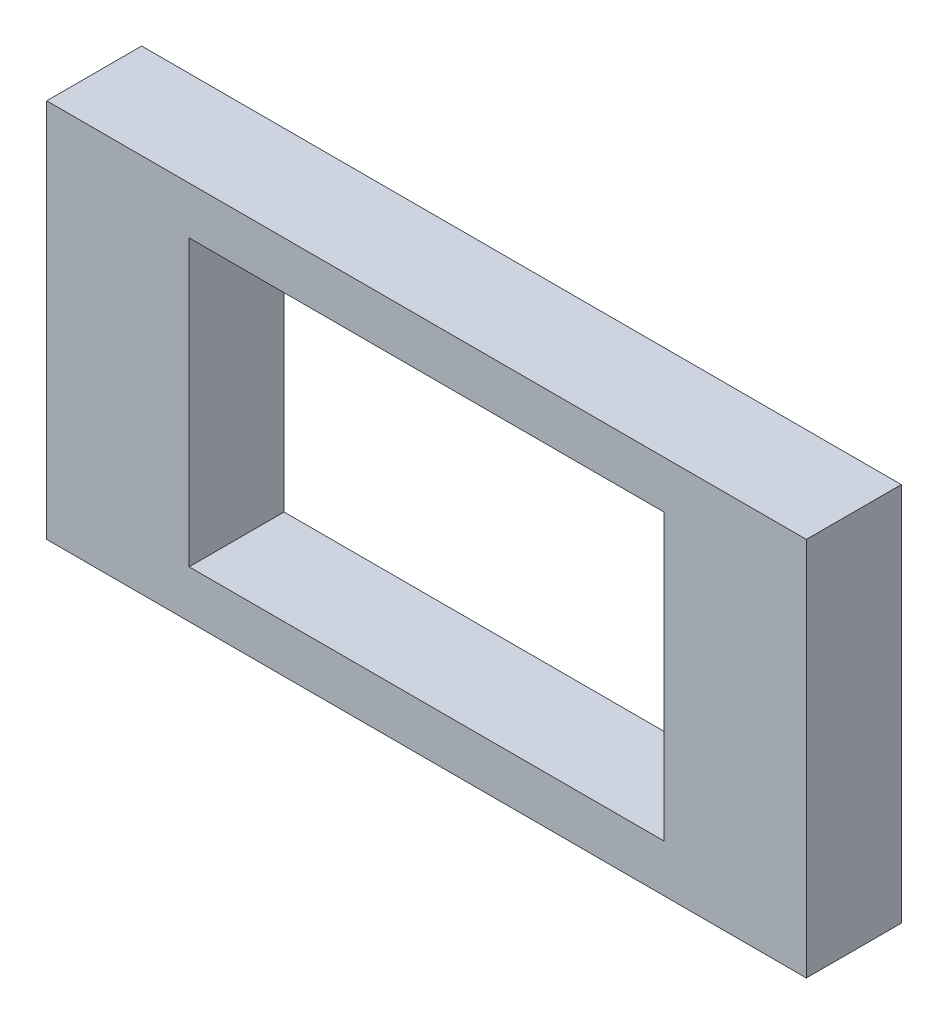
ISO-10303-21;
HEADER;
FILE_DESCRIPTION(('STEP AP214'),'2;1');
FILE_NAME('part.step','',(''),(''),'','','');
FILE_SCHEMA(('AUTOMOTIVE_DESIGN { 1 0 10303 214 1 1 1 1 }'));
ENDSEC;
DATA;
#1=APPLICATION_CONTEXT('core data for automotive mechanical design processes');
#2=APPLICATION_PROTOCOL_DEFINITION('international standard','automotive_design',2000,#1);
#3=PRODUCT_CONTEXT('',#1,'mechanical');
#4=PRODUCT('Part','Part','',(#3));
#5=PRODUCT_RELATED_PRODUCT_CATEGORY('part','',(#4));
#6=PRODUCT_DEFINITION_FORMATION('','',#4);
#7=PRODUCT_DEFINITION_CONTEXT('part definition',#1,'design');
#8=PRODUCT_DEFINITION('design','',#6,#7);
#9=PRODUCT_DEFINITION_SHAPE('','',#8);
#10=(LENGTH_UNIT() NAMED_UNIT(*) SI_UNIT(.MILLI.,.METRE.));
#11=(NAMED_UNIT(*) PLANE_ANGLE_UNIT() SI_UNIT($,.RADIAN.));
#12=(NAMED_UNIT(*) SI_UNIT($,.STERADIAN.) SOLID_ANGLE_UNIT());
#13=UNCERTAINTY_MEASURE_WITH_UNIT(LENGTH_MEASURE(1.E-05),#10,'distance_accuracy_value','');
#14=(GEOMETRIC_REPRESENTATION_CONTEXT(3) GLOBAL_UNCERTAINTY_ASSIGNED_CONTEXT((#13)) GLOBAL_UNIT_ASSIGNED_CONTEXT((#10,
#11,#12)) REPRESENTATION_CONTEXT('',''));
#15=CARTESIAN_POINT('',(0.,0.,0.));
#16=DIRECTION('',(0.,0.,1.));
#17=DIRECTION('',(1.,0.,0.));
#18=AXIS2_PLACEMENT_3D('',#15,#16,#17);
#19=CARTESIAN_POINT('',(0.,0.,2.));
#20=DIRECTION('',(0.,0.,-1.));
#21=DIRECTION('',(-1.,0.,0.));
#22=AXIS2_PLACEMENT_3D('',#19,#20,#21);
#23=PLANE('',#22);
#24=DIRECTION('',(0.,1.,0.));
#25=VECTOR('',#24,1.);
#26=CARTESIAN_POINT('',(8.,-4.,2.));
#27=LINE('',#26,#25);
#28=CARTESIAN_POINT('',(8.,-4.,2.));
#29=VERTEX_POINT('',#28);
#30=CARTESIAN_POINT('',(8.,4.,2.));
#31=VERTEX_POINT('',#30);
#32=EDGE_CURVE('E134',#29,#31,#27,.T.);
#33=ORIENTED_EDGE('',*,*,#32,.T.);
#34=DIRECTION('',(-1.,0.,0.));
#35=VECTOR('',#34,1.);
#36=CARTESIAN_POINT('',(-8.,4.,2.));
#37=LINE('',#36,#35);
#38=CARTESIAN_POINT('',(-8.,4.,2.));
#39=VERTEX_POINT('',#38);
#40=EDGE_CURVE('E137',#31,#39,#37,.T.);
#41=ORIENTED_EDGE('',*,*,#40,.T.);
#42=DIRECTION('',(0.,-1.,0.));
#43=VECTOR('',#42,1.);
#44=CARTESIAN_POINT('',(-8.,-4.,2.));
#45=LINE('',#44,#43);
#46=CARTESIAN_POINT('',(-8.,-4.,2.));
#47=VERTEX_POINT('',#46);
#48=EDGE_CURVE('E140',#39,#47,#45,.T.);
#49=ORIENTED_EDGE('',*,*,#48,.T.);
#50=DIRECTION('',(1.,0.,0.));
#51=VECTOR('',#50,1.);
#52=CARTESIAN_POINT('',(-8.,-4.,2.));
#53=LINE('',#52,#51);
#54=EDGE_CURVE('E142',#47,#29,#53,.T.);
#55=ORIENTED_EDGE('',*,*,#54,.T.);
#56=EDGE_LOOP('',(#33,#41,#49,#55));
#57=FACE_BOUND('',#56,.T.);
#58=DIRECTION('',(0.,1.,0.));
#59=VECTOR('',#58,1.);
#60=CARTESIAN_POINT('',(5.,-3.,2.));
#61=LINE('',#60,#59);
#62=CARTESIAN_POINT('',(5.,-3.,2.));
#63=VERTEX_POINT('',#62);
#64=CARTESIAN_POINT('',(5.,3.,2.));
#65=VERTEX_POINT('',#64);
#66=EDGE_CURVE('E98',#63,#65,#61,.T.);
#67=ORIENTED_EDGE('',*,*,#66,.F.);
#68=DIRECTION('',(1.,0.,0.));
#69=VECTOR('',#68,1.);
#70=CARTESIAN_POINT('',(-5.,-3.,2.));
#71=LINE('',#70,#69);
#72=CARTESIAN_POINT('',(-5.,-3.,2.));
#73=VERTEX_POINT('',#72);
#74=EDGE_CURVE('E120',#73,#63,#71,.T.);
#75=ORIENTED_EDGE('',*,*,#74,.F.);
#76=DIRECTION('',(0.,-1.,0.));
#77=VECTOR('',#76,1.);
#78=CARTESIAN_POINT('',(-5.,-3.,2.));
#79=LINE('',#78,#77);
#80=CARTESIAN_POINT('',(-5.,3.,2.));
#81=VERTEX_POINT('',#80);
#82=EDGE_CURVE('E118',#81,#73,#79,.T.);
#83=ORIENTED_EDGE('',*,*,#82,.F.);
#84=DIRECTION('',(-1.,0.,0.));
#85=VECTOR('',#84,1.);
#86=CARTESIAN_POINT('',(-5.,3.,2.));
#87=LINE('',#86,#85);
#88=EDGE_CURVE('E106',#65,#81,#87,.T.);
#89=ORIENTED_EDGE('',*,*,#88,.F.);
#90=EDGE_LOOP('',(#67,#75,#83,#89));
#91=FACE_BOUND('',#90,.T.);
#92=ADVANCED_FACE('F33',(#57,#91),#23,.F.);
#93=CARTESIAN_POINT('',(0.,0.,0.));
#94=DIRECTION('',(0.,0.,-1.));
#95=DIRECTION('',(-1.,0.,0.));
#96=AXIS2_PLACEMENT_3D('',#93,#94,#95);
#97=PLANE('',#96);
#98=DIRECTION('',(0.,1.,0.));
#99=VECTOR('',#98,1.);
#100=CARTESIAN_POINT('',(8.,-4.,0.));
#101=LINE('',#100,#99);
#102=CARTESIAN_POINT('',(8.,-4.,0.));
#103=VERTEX_POINT('',#102);
#104=CARTESIAN_POINT('',(8.,4.,0.));
#105=VERTEX_POINT('',#104);
#106=EDGE_CURVE('E114',#103,#105,#101,.T.);
#107=ORIENTED_EDGE('',*,*,#106,.F.);
#108=DIRECTION('',(1.,0.,0.));
#109=VECTOR('',#108,1.);
#110=CARTESIAN_POINT('',(-8.,-4.,0.));
#111=LINE('',#110,#109);
#112=CARTESIAN_POINT('',(-8.,-4.,0.));
#113=VERTEX_POINT('',#112);
#114=EDGE_CURVE('E138',#113,#103,#111,.T.);
#115=ORIENTED_EDGE('',*,*,#114,.F.);
#116=DIRECTION('',(0.,-1.,0.));
#117=VECTOR('',#116,1.);
#118=CARTESIAN_POINT('',(-8.,-4.,0.));
#119=LINE('',#118,#117);
#120=CARTESIAN_POINT('',(-8.,4.,0.));
#121=VERTEX_POINT('',#120);
#122=EDGE_CURVE('E149',#121,#113,#119,.T.);
#123=ORIENTED_EDGE('',*,*,#122,.F.);
#124=DIRECTION('',(-1.,0.,0.));
#125=VECTOR('',#124,1.);
#126=CARTESIAN_POINT('',(-8.,4.,0.));
#127=LINE('',#126,#125);
#128=EDGE_CURVE('E147',#105,#121,#127,.T.);
#129=ORIENTED_EDGE('',*,*,#128,.F.);
#130=EDGE_LOOP('',(#107,#115,#123,#129));
#131=FACE_BOUND('',#130,.T.);
#132=DIRECTION('',(1.,0.,0.));
#133=VECTOR('',#132,1.);
#134=CARTESIAN_POINT('',(-5.,-3.,0.));
#135=LINE('',#134,#133);
#136=CARTESIAN_POINT('',(-5.,-3.,0.));
#137=VERTEX_POINT('',#136);
#138=CARTESIAN_POINT('',(5.,-3.,0.));
#139=VERTEX_POINT('',#138);
#140=EDGE_CURVE('E107',#137,#139,#135,.T.);
#141=ORIENTED_EDGE('',*,*,#140,.T.);
#142=DIRECTION('',(0.,1.,0.));
#143=VECTOR('',#142,1.);
#144=CARTESIAN_POINT('',(5.,-3.,0.));
#145=LINE('',#144,#143);
#146=CARTESIAN_POINT('',(5.,3.,0.));
#147=VERTEX_POINT('',#146);
#148=EDGE_CURVE('E56',#139,#147,#145,.T.);
#149=ORIENTED_EDGE('',*,*,#148,.T.);
#150=DIRECTION('',(-1.,0.,0.));
#151=VECTOR('',#150,1.);
#152=CARTESIAN_POINT('',(-5.,3.,0.));
#153=LINE('',#152,#151);
#154=CARTESIAN_POINT('',(-5.,3.,0.));
#155=VERTEX_POINT('',#154);
#156=EDGE_CURVE('E113',#147,#155,#153,.T.);
#157=ORIENTED_EDGE('',*,*,#156,.T.);
#158=DIRECTION('',(0.,-1.,0.));
#159=VECTOR('',#158,1.);
#160=CARTESIAN_POINT('',(-5.,-3.,0.));
#161=LINE('',#160,#159);
#162=EDGE_CURVE('E126',#155,#137,#161,.T.);
#163=ORIENTED_EDGE('',*,*,#162,.T.);
#164=EDGE_LOOP('',(#141,#149,#157,#163));
#165=FACE_BOUND('',#164,.T.);
#166=ADVANCED_FACE('F167',(#131,#165),#97,.T.);
#167=CARTESIAN_POINT('',(8.,-4.,2.));
#168=DIRECTION('',(-1.,0.,0.));
#169=DIRECTION('',(0.,0.,1.));
#170=AXIS2_PLACEMENT_3D('',#167,#168,#169);
#171=PLANE('',#170);
#172=ORIENTED_EDGE('',*,*,#106,.T.);
#173=DIRECTION('',(0.,0.,-1.));
#174=VECTOR('',#173,1.);
#175=CARTESIAN_POINT('',(8.,4.,2.));
#176=LINE('',#175,#174);
#177=EDGE_CURVE('E11',#31,#105,#176,.T.);
#178=ORIENTED_EDGE('',*,*,#177,.F.);
#179=ORIENTED_EDGE('',*,*,#32,.F.);
#180=DIRECTION('',(0.,0.,-1.));
#181=VECTOR('',#180,1.);
#182=CARTESIAN_POINT('',(8.,-4.,2.));
#183=LINE('',#182,#181);
#184=EDGE_CURVE('E144',#29,#103,#183,.T.);
#185=ORIENTED_EDGE('',*,*,#184,.T.);
#186=EDGE_LOOP('',(#172,#178,#179,#185));
#187=FACE_BOUND('',#186,.T.);
#188=ADVANCED_FACE('F35',(#187),#171,.F.);
#189=CARTESIAN_POINT('',(-8.,4.,2.));
#190=DIRECTION('',(0.,-1.,0.));
#191=DIRECTION('',(0.,0.,-1.));
#192=AXIS2_PLACEMENT_3D('',#189,#190,#191);
#193=PLANE('',#192);
#194=ORIENTED_EDGE('',*,*,#128,.T.);
#195=DIRECTION('',(0.,0.,-1.));
#196=VECTOR('',#195,1.);
#197=CARTESIAN_POINT('',(-8.,4.,2.));
#198=LINE('',#197,#196);
#199=EDGE_CURVE('E41',#39,#121,#198,.T.);
#200=ORIENTED_EDGE('',*,*,#199,.F.);
#201=ORIENTED_EDGE('',*,*,#40,.F.);
#202=ORIENTED_EDGE('',*,*,#177,.T.);
#203=EDGE_LOOP('',(#194,#200,#201,#202));
#204=FACE_BOUND('',#203,.T.);
#205=ADVANCED_FACE('F177',(#204),#193,.F.);
#206=CARTESIAN_POINT('',(-8.,-4.,2.));
#207=DIRECTION('',(1.,0.,0.));
#208=DIRECTION('',(0.,0.,-1.));
#209=AXIS2_PLACEMENT_3D('',#206,#207,#208);
#210=PLANE('',#209);
#211=ORIENTED_EDGE('',*,*,#122,.T.);
#212=DIRECTION('',(0.,0.,-1.));
#213=VECTOR('',#212,1.);
#214=CARTESIAN_POINT('',(-8.,-4.,2.));
#215=LINE('',#214,#213);
#216=EDGE_CURVE('E154',#47,#113,#215,.T.);
#217=ORIENTED_EDGE('',*,*,#216,.F.);
#218=ORIENTED_EDGE('',*,*,#48,.F.);
#219=ORIENTED_EDGE('',*,*,#199,.T.);
#220=EDGE_LOOP('',(#211,#217,#218,#219));
#221=FACE_BOUND('',#220,.T.);
#222=ADVANCED_FACE('F161',(#221),#210,.F.);
#223=CARTESIAN_POINT('',(-8.,-4.,2.));
#224=DIRECTION('',(0.,1.,0.));
#225=DIRECTION('',(0.,0.,1.));
#226=AXIS2_PLACEMENT_3D('',#223,#224,#225);
#227=PLANE('',#226);
#228=ORIENTED_EDGE('',*,*,#114,.T.);
#229=ORIENTED_EDGE('',*,*,#184,.F.);
#230=ORIENTED_EDGE('',*,*,#54,.F.);
#231=ORIENTED_EDGE('',*,*,#216,.T.);
#232=EDGE_LOOP('',(#228,#229,#230,#231));
#233=FACE_BOUND('',#232,.T.);
#234=ADVANCED_FACE('F171',(#233),#227,.F.);
#235=CARTESIAN_POINT('',(5.,-3.,2.));
#236=DIRECTION('',(-1.,0.,0.));
#237=DIRECTION('',(0.,0.,1.));
#238=AXIS2_PLACEMENT_3D('',#235,#236,#237);
#239=PLANE('',#238);
#240=ORIENTED_EDGE('',*,*,#148,.F.);
#241=DIRECTION('',(0.,0.,-1.));
#242=VECTOR('',#241,1.);
#243=CARTESIAN_POINT('',(5.,-3.,2.));
#244=LINE('',#243,#242);
#245=EDGE_CURVE('E102',#63,#139,#244,.T.);
#246=ORIENTED_EDGE('',*,*,#245,.F.);
#247=ORIENTED_EDGE('',*,*,#66,.T.);
#248=DIRECTION('',(0.,0.,-1.));
#249=VECTOR('',#248,1.);
#250=CARTESIAN_POINT('',(5.,3.,2.));
#251=LINE('',#250,#249);
#252=EDGE_CURVE('E101',#65,#147,#251,.T.);
#253=ORIENTED_EDGE('',*,*,#252,.T.);
#254=EDGE_LOOP('',(#240,#246,#247,#253));
#255=FACE_BOUND('',#254,.T.);
#256=ADVANCED_FACE('F100',(#255),#239,.T.);
#257=CARTESIAN_POINT('',(-5.,3.,2.));
#258=DIRECTION('',(0.,-1.,0.));
#259=DIRECTION('',(0.,0.,-1.));
#260=AXIS2_PLACEMENT_3D('',#257,#258,#259);
#261=PLANE('',#260);
#262=ORIENTED_EDGE('',*,*,#156,.F.);
#263=ORIENTED_EDGE('',*,*,#252,.F.);
#264=ORIENTED_EDGE('',*,*,#88,.T.);
#265=DIRECTION('',(0.,0.,-1.));
#266=VECTOR('',#265,1.);
#267=CARTESIAN_POINT('',(-5.,3.,2.));
#268=LINE('',#267,#266);
#269=EDGE_CURVE('E115',#81,#155,#268,.T.);
#270=ORIENTED_EDGE('',*,*,#269,.T.);
#271=EDGE_LOOP('',(#262,#263,#264,#270));
#272=FACE_BOUND('',#271,.T.);
#273=ADVANCED_FACE('F110',(#272),#261,.T.);
#274=CARTESIAN_POINT('',(-5.,-3.,2.));
#275=DIRECTION('',(1.,0.,0.));
#276=DIRECTION('',(0.,0.,-1.));
#277=AXIS2_PLACEMENT_3D('',#274,#275,#276);
#278=PLANE('',#277);
#279=ORIENTED_EDGE('',*,*,#162,.F.);
#280=ORIENTED_EDGE('',*,*,#269,.F.);
#281=ORIENTED_EDGE('',*,*,#82,.T.);
#282=DIRECTION('',(0.,0.,-1.));
#283=VECTOR('',#282,1.);
#284=CARTESIAN_POINT('',(-5.,-3.,2.));
#285=LINE('',#284,#283);
#286=EDGE_CURVE('E48',#73,#137,#285,.T.);
#287=ORIENTED_EDGE('',*,*,#286,.T.);
#288=EDGE_LOOP('',(#279,#280,#281,#287));
#289=FACE_BOUND('',#288,.T.);
#290=ADVANCED_FACE('F200',(#289),#278,.T.);
#291=CARTESIAN_POINT('',(-5.,-3.,2.));
#292=DIRECTION('',(0.,1.,0.));
#293=DIRECTION('',(0.,0.,1.));
#294=AXIS2_PLACEMENT_3D('',#291,#292,#293);
#295=PLANE('',#294);
#296=ORIENTED_EDGE('',*,*,#140,.F.);
#297=ORIENTED_EDGE('',*,*,#286,.F.);
#298=ORIENTED_EDGE('',*,*,#74,.T.);
#299=ORIENTED_EDGE('',*,*,#245,.T.);
#300=EDGE_LOOP('',(#296,#297,#298,#299));
#301=FACE_BOUND('',#300,.T.);
#302=ADVANCED_FACE('F204',(#301),#295,.T.);
#303=CLOSED_SHELL('',(#92,#166,#188,#205,#222,#234,#256,#273,#290,#302));
#304=MANIFOLD_SOLID_BREP('B2',#303);
#305=ADVANCED_BREP_SHAPE_REPRESENTATION('',(#18,#304),#14);
#306=SHAPE_DEFINITION_REPRESENTATION(#9,#305);
ENDSEC;
END-ISO-10303-21;
